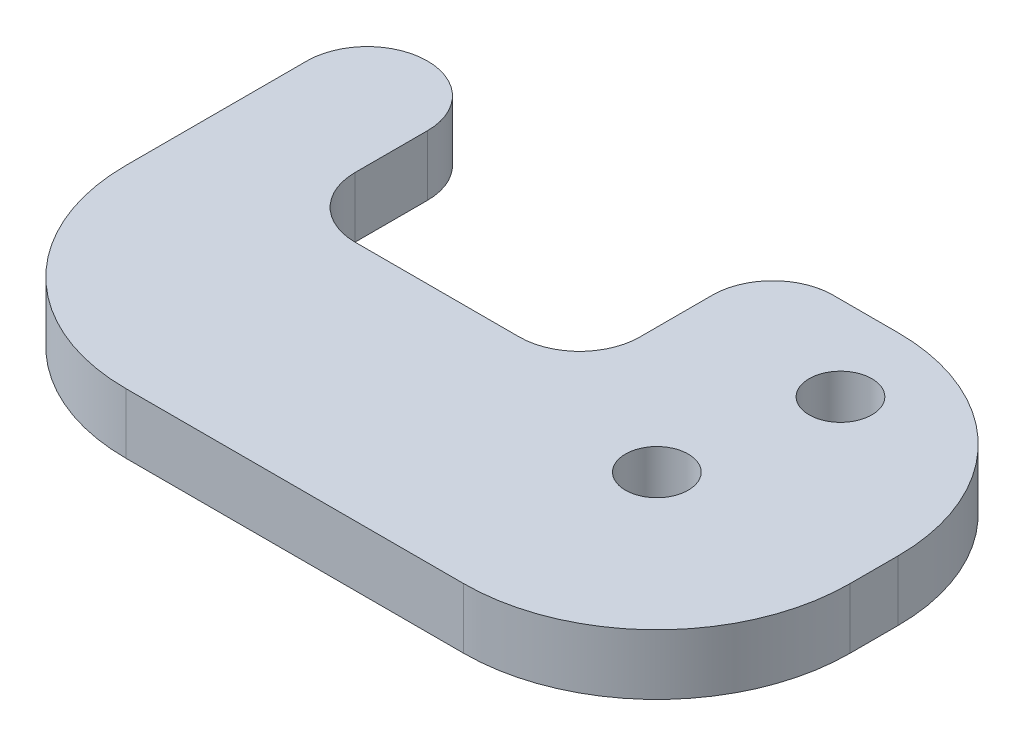
ISO-10303-21;
HEADER;
FILE_DESCRIPTION(('STEP AP214'),'2;1');
FILE_NAME('part.step','',(''),(''),'','','');
FILE_SCHEMA(('AUTOMOTIVE_DESIGN { 1 0 10303 214 1 1 1 1 }'));
ENDSEC;
DATA;
#1=APPLICATION_CONTEXT('core data for automotive mechanical design processes');
#2=APPLICATION_PROTOCOL_DEFINITION('international standard','automotive_design',2000,#1);
#3=PRODUCT_CONTEXT('',#1,'mechanical');
#4=PRODUCT('Part','Part','',(#3));
#5=PRODUCT_RELATED_PRODUCT_CATEGORY('part','',(#4));
#6=PRODUCT_DEFINITION_FORMATION('','',#4);
#7=PRODUCT_DEFINITION_CONTEXT('part definition',#1,'design');
#8=PRODUCT_DEFINITION('design','',#6,#7);
#9=PRODUCT_DEFINITION_SHAPE('','',#8);
#10=(LENGTH_UNIT() NAMED_UNIT(*) SI_UNIT(.MILLI.,.METRE.));
#11=(NAMED_UNIT(*) PLANE_ANGLE_UNIT() SI_UNIT($,.RADIAN.));
#12=(NAMED_UNIT(*) SI_UNIT($,.STERADIAN.) SOLID_ANGLE_UNIT());
#13=UNCERTAINTY_MEASURE_WITH_UNIT(LENGTH_MEASURE(1.E-05),#10,'distance_accuracy_value','');
#14=(GEOMETRIC_REPRESENTATION_CONTEXT(3) GLOBAL_UNCERTAINTY_ASSIGNED_CONTEXT((#13)) GLOBAL_UNIT_ASSIGNED_CONTEXT((#10,
#11,#12)) REPRESENTATION_CONTEXT('',''));
#15=CARTESIAN_POINT('',(0.,0.,0.));
#16=DIRECTION('',(0.,0.,1.));
#17=DIRECTION('',(1.,0.,0.));
#18=AXIS2_PLACEMENT_3D('',#15,#16,#17);
#19=CARTESIAN_POINT('',(-19.05,3.175,-11.43));
#20=DIRECTION('',(0.,0.,1.));
#21=DIRECTION('',(1.,0.,0.));
#22=AXIS2_PLACEMENT_3D('',#19,#20,#21);
#23=PLANE('',#22);
#24=DIRECTION('',(-1.,0.,0.));
#25=VECTOR('',#24,1.);
#26=CARTESIAN_POINT('',(-19.05,0.,-11.43));
#27=LINE('',#26,#25);
#28=CARTESIAN_POINT('',(8.89,0.,-11.43));
#29=VERTEX_POINT('',#28);
#30=CARTESIAN_POINT('',(5.46099999999999,0.,-11.43));
#31=VERTEX_POINT('',#30);
#32=EDGE_CURVE('E170',#29,#31,#27,.T.);
#33=ORIENTED_EDGE('',*,*,#32,.T.);
#34=DIRECTION('',(0.,1.,0.));
#35=VECTOR('',#34,1.);
#36=CARTESIAN_POINT('',(5.46099999999999,3.175,-11.43));
#37=LINE('',#36,#35);
#38=CARTESIAN_POINT('',(5.46099999999999,3.175,-11.43));
#39=VERTEX_POINT('',#38);
#40=EDGE_CURVE('E214',#31,#39,#37,.T.);
#41=ORIENTED_EDGE('',*,*,#40,.T.);
#42=DIRECTION('',(-1.,0.,0.));
#43=VECTOR('',#42,1.);
#44=CARTESIAN_POINT('',(-19.05,3.175,-11.43));
#45=LINE('',#44,#43);
#46=CARTESIAN_POINT('',(8.89,3.175,-11.43));
#47=VERTEX_POINT('',#46);
#48=EDGE_CURVE('E179',#47,#39,#45,.T.);
#49=ORIENTED_EDGE('',*,*,#48,.F.);
#50=DIRECTION('',(0.,-1.,0.));
#51=VECTOR('',#50,1.);
#52=CARTESIAN_POINT('',(8.89,3.175,-11.43));
#53=LINE('',#52,#51);
#54=EDGE_CURVE('E190',#47,#29,#53,.T.);
#55=ORIENTED_EDGE('',*,*,#54,.T.);
#56=EDGE_LOOP('',(#33,#41,#49,#55));
#57=FACE_BOUND('',#56,.T.);
#58=ADVANCED_FACE('F34',(#57),#23,.F.);
#59=CARTESIAN_POINT('',(-19.05,3.175,-11.43));
#60=DIRECTION('',(1.,0.,0.));
#61=DIRECTION('',(0.,0.,-1.));
#62=AXIS2_PLACEMENT_3D('',#59,#60,#61);
#63=PLANE('',#62);
#64=DIRECTION('',(0.,0.,1.));
#65=VECTOR('',#64,1.);
#66=CARTESIAN_POINT('',(-19.05,3.175,-11.43));
#67=LINE('',#66,#65);
#68=CARTESIAN_POINT('',(-19.05,3.175,-8.255));
#69=VERTEX_POINT('',#68);
#70=CARTESIAN_POINT('',(-19.05,3.175,1.27));
#71=VERTEX_POINT('',#70);
#72=EDGE_CURVE('E178',#69,#71,#67,.T.);
#73=ORIENTED_EDGE('',*,*,#72,.F.);
#74=DIRECTION('',(0.,-1.,0.));
#75=VECTOR('',#74,1.);
#76=CARTESIAN_POINT('',(-19.05,3.175,-8.255));
#77=LINE('',#76,#75);
#78=CARTESIAN_POINT('',(-19.05,0.,-8.255));
#79=VERTEX_POINT('',#78);
#80=EDGE_CURVE('E50',#69,#79,#77,.T.);
#81=ORIENTED_EDGE('',*,*,#80,.T.);
#82=DIRECTION('',(0.,0.,1.));
#83=VECTOR('',#82,1.);
#84=CARTESIAN_POINT('',(-19.05,0.,-11.43));
#85=LINE('',#84,#83);
#86=CARTESIAN_POINT('',(-19.05,0.,1.27));
#87=VERTEX_POINT('',#86);
#88=EDGE_CURVE('E167',#79,#87,#85,.T.);
#89=ORIENTED_EDGE('',*,*,#88,.T.);
#90=DIRECTION('',(0.,-1.,0.));
#91=VECTOR('',#90,1.);
#92=CARTESIAN_POINT('',(-19.05,3.175,1.27));
#93=LINE('',#92,#91);
#94=EDGE_CURVE('E149',#87,#71,#93,.F.);
#95=ORIENTED_EDGE('',*,*,#94,.T.);
#96=EDGE_LOOP('',(#73,#81,#89,#95));
#97=FACE_BOUND('',#96,.T.);
#98=ADVANCED_FACE('F302',(#97),#63,.F.);
#99=CARTESIAN_POINT('',(-19.05,3.175,11.43));
#100=DIRECTION('',(0.,0.,-1.));
#101=DIRECTION('',(-1.,0.,0.));
#102=AXIS2_PLACEMENT_3D('',#99,#100,#101);
#103=PLANE('',#102);
#104=DIRECTION('',(1.,0.,0.));
#105=VECTOR('',#104,1.);
#106=CARTESIAN_POINT('',(-19.05,3.175,11.43));
#107=LINE('',#106,#105);
#108=CARTESIAN_POINT('',(-8.89,3.175,11.43));
#109=VERTEX_POINT('',#108);
#110=CARTESIAN_POINT('',(8.89,3.175,11.43));
#111=VERTEX_POINT('',#110);
#112=EDGE_CURVE('E160',#109,#111,#107,.T.);
#113=ORIENTED_EDGE('',*,*,#112,.F.);
#114=DIRECTION('',(0.,-1.,0.));
#115=VECTOR('',#114,1.);
#116=CARTESIAN_POINT('',(-8.89,3.175,11.43));
#117=LINE('',#116,#115);
#118=CARTESIAN_POINT('',(-8.89,0.,11.43));
#119=VERTEX_POINT('',#118);
#120=EDGE_CURVE('E147',#109,#119,#117,.T.);
#121=ORIENTED_EDGE('',*,*,#120,.T.);
#122=DIRECTION('',(1.,0.,0.));
#123=VECTOR('',#122,1.);
#124=CARTESIAN_POINT('',(-19.05,0.,11.43));
#125=LINE('',#124,#123);
#126=CARTESIAN_POINT('',(8.89,0.,11.43));
#127=VERTEX_POINT('',#126);
#128=EDGE_CURVE('E157',#119,#127,#125,.T.);
#129=ORIENTED_EDGE('',*,*,#128,.T.);
#130=DIRECTION('',(0.,-1.,0.));
#131=VECTOR('',#130,1.);
#132=CARTESIAN_POINT('',(8.89,3.175,11.43));
#133=LINE('',#132,#131);
#134=EDGE_CURVE('E161',#127,#111,#133,.F.);
#135=ORIENTED_EDGE('',*,*,#134,.T.);
#136=EDGE_LOOP('',(#113,#121,#129,#135));
#137=FACE_BOUND('',#136,.T.);
#138=ADVANCED_FACE('F156',(#137),#103,.F.);
#139=CARTESIAN_POINT('',(19.05,3.175,-11.43));
#140=DIRECTION('',(-1.,0.,0.));
#141=DIRECTION('',(0.,0.,1.));
#142=AXIS2_PLACEMENT_3D('',#139,#140,#141);
#143=PLANE('',#142);
#144=DIRECTION('',(0.,0.,-1.));
#145=VECTOR('',#144,1.);
#146=CARTESIAN_POINT('',(19.05,0.,-11.43));
#147=LINE('',#146,#145);
#148=CARTESIAN_POINT('',(19.05,0.,1.27));
#149=VERTEX_POINT('',#148);
#150=CARTESIAN_POINT('',(19.05,0.,-1.27));
#151=VERTEX_POINT('',#150);
#152=EDGE_CURVE('E166',#149,#151,#147,.T.);
#153=ORIENTED_EDGE('',*,*,#152,.T.);
#154=DIRECTION('',(0.,-1.,0.));
#155=VECTOR('',#154,1.);
#156=CARTESIAN_POINT('',(19.05,3.175,-1.27));
#157=LINE('',#156,#155);
#158=CARTESIAN_POINT('',(19.05,3.175,-1.27));
#159=VERTEX_POINT('',#158);
#160=EDGE_CURVE('E195',#151,#159,#157,.F.);
#161=ORIENTED_EDGE('',*,*,#160,.T.);
#162=DIRECTION('',(0.,0.,-1.));
#163=VECTOR('',#162,1.);
#164=CARTESIAN_POINT('',(19.05,3.175,-11.43));
#165=LINE('',#164,#163);
#166=CARTESIAN_POINT('',(19.05,3.175,1.27));
#167=VERTEX_POINT('',#166);
#168=EDGE_CURVE('E283',#167,#159,#165,.T.);
#169=ORIENTED_EDGE('',*,*,#168,.F.);
#170=DIRECTION('',(0.,-1.,0.));
#171=VECTOR('',#170,1.);
#172=CARTESIAN_POINT('',(19.05,3.175,1.27));
#173=LINE('',#172,#171);
#174=EDGE_CURVE('E187',#167,#149,#173,.T.);
#175=ORIENTED_EDGE('',*,*,#174,.T.);
#176=EDGE_LOOP('',(#153,#161,#169,#175));
#177=FACE_BOUND('',#176,.T.);
#178=ADVANCED_FACE('F295',(#177),#143,.F.);
#179=CARTESIAN_POINT('',(0.,3.175,0.));
#180=DIRECTION('',(0.,1.,0.));
#181=DIRECTION('',(0.,0.,1.));
#182=AXIS2_PLACEMENT_3D('',#179,#180,#181);
#183=PLANE('',#182);
#184=ORIENTED_EDGE('',*,*,#48,.T.);
#185=CARTESIAN_POINT('',(5.46099999999999,3.175,-8.255));
#186=DIRECTION('',(0.,1.,0.));
#187=DIRECTION('',(0.,0.,1.));
#188=AXIS2_PLACEMENT_3D('',#185,#186,#187);
#189=CIRCLE('',#188,3.175);
#190=CARTESIAN_POINT('',(2.28599999999999,3.175,-8.255));
#191=VERTEX_POINT('',#190);
#192=EDGE_CURVE('E221',#39,#191,#189,.T.);
#193=ORIENTED_EDGE('',*,*,#192,.T.);
#194=DIRECTION('',(0.,0.,1.));
#195=VECTOR('',#194,1.);
#196=CARTESIAN_POINT('',(2.28599999999999,3.175,-11.43));
#197=LINE('',#196,#195);
#198=CARTESIAN_POINT('',(2.28599999999999,3.175,-4.44499999999997));
#199=VERTEX_POINT('',#198);
#200=EDGE_CURVE('E242',#191,#199,#197,.T.);
#201=ORIENTED_EDGE('',*,*,#200,.T.);
#202=CARTESIAN_POINT('',(-0.889000000000006,3.175,-4.44499999999997));
#203=DIRECTION('',(0.,1.,0.));
#204=DIRECTION('',(0.,0.,1.));
#205=AXIS2_PLACEMENT_3D('',#202,#203,#204);
#206=CIRCLE('',#205,3.175);
#207=CARTESIAN_POINT('',(-0.889000000000006,3.175,-1.26999999999997));
#208=VERTEX_POINT('',#207);
#209=EDGE_CURVE('E43',#199,#208,#206,.F.);
#210=ORIENTED_EDGE('',*,*,#209,.T.);
#211=DIRECTION('',(1.,0.,0.));
#212=VECTOR('',#211,1.);
#213=CARTESIAN_POINT('',(-12.7,3.175,-1.26999999999997));
#214=LINE('',#213,#212);
#215=CARTESIAN_POINT('',(-9.525,3.175,-1.26999999999997));
#216=VERTEX_POINT('',#215);
#217=EDGE_CURVE('E240',#216,#208,#214,.T.);
#218=ORIENTED_EDGE('',*,*,#217,.F.);
#219=CARTESIAN_POINT('',(-9.525,3.175,-4.44499999999997));
#220=DIRECTION('',(0.,1.,0.));
#221=DIRECTION('',(0.,0.,1.));
#222=AXIS2_PLACEMENT_3D('',#219,#220,#221);
#223=CIRCLE('',#222,3.175);
#224=CARTESIAN_POINT('',(-12.7,3.175,-4.44499999999996));
#225=VERTEX_POINT('',#224);
#226=EDGE_CURVE('E229',#216,#225,#223,.F.);
#227=ORIENTED_EDGE('',*,*,#226,.T.);
#228=DIRECTION('',(0.,0.,1.));
#229=VECTOR('',#228,1.);
#230=CARTESIAN_POINT('',(-12.7,3.175,-11.43));
#231=LINE('',#230,#229);
#232=CARTESIAN_POINT('',(-12.7,3.175,-8.255));
#233=VERTEX_POINT('',#232);
#234=EDGE_CURVE('E251',#233,#225,#231,.T.);
#235=ORIENTED_EDGE('',*,*,#234,.F.);
#236=CARTESIAN_POINT('',(-15.875,3.175,-8.255));
#237=DIRECTION('',(0.,1.,0.));
#238=DIRECTION('',(0.,0.,1.));
#239=AXIS2_PLACEMENT_3D('',#236,#237,#238);
#240=CIRCLE('',#239,3.175);
#241=CARTESIAN_POINT('',(-15.875,3.175,-11.43));
#242=VERTEX_POINT('',#241);
#243=EDGE_CURVE('E219',#233,#242,#240,.T.);
#244=ORIENTED_EDGE('',*,*,#243,.T.);
#245=CARTESIAN_POINT('',(-15.875,3.175,-8.255));
#246=DIRECTION('',(0.,1.,0.));
#247=DIRECTION('',(0.,0.,1.));
#248=AXIS2_PLACEMENT_3D('',#245,#246,#247);
#249=CIRCLE('',#248,3.175);
#250=EDGE_CURVE('E217',#242,#69,#249,.T.);
#251=ORIENTED_EDGE('',*,*,#250,.T.);
#252=ORIENTED_EDGE('',*,*,#72,.T.);
#253=CARTESIAN_POINT('',(-8.89,3.175,1.27));
#254=DIRECTION('',(0.,1.,0.));
#255=DIRECTION('',(0.,0.,1.));
#256=AXIS2_PLACEMENT_3D('',#253,#254,#255);
#257=CIRCLE('',#256,10.16);
#258=EDGE_CURVE('E185',#71,#109,#257,.T.);
#259=ORIENTED_EDGE('',*,*,#258,.T.);
#260=ORIENTED_EDGE('',*,*,#112,.T.);
#261=CARTESIAN_POINT('',(8.89,3.175,1.27));
#262=DIRECTION('',(0.,1.,0.));
#263=DIRECTION('',(0.,0.,1.));
#264=AXIS2_PLACEMENT_3D('',#261,#262,#263);
#265=CIRCLE('',#264,10.16);
#266=EDGE_CURVE('E183',#111,#167,#265,.T.);
#267=ORIENTED_EDGE('',*,*,#266,.T.);
#268=ORIENTED_EDGE('',*,*,#168,.T.);
#269=CARTESIAN_POINT('',(8.89,3.175,-1.27));
#270=DIRECTION('',(0.,1.,0.));
#271=DIRECTION('',(0.,0.,1.));
#272=AXIS2_PLACEMENT_3D('',#269,#270,#271);
#273=CIRCLE('',#272,10.16);
#274=EDGE_CURVE('E197',#159,#47,#273,.T.);
#275=ORIENTED_EDGE('',*,*,#274,.T.);
#276=EDGE_LOOP('',(#184,#193,#201,#210,#218,#227,#235,#244,#251,#252,#259,#260,#267,#268,#275));
#277=FACE_BOUND('',#276,.T.);
#278=CARTESIAN_POINT('',(10.287,3.175,-6.99476345699017));
#279=DIRECTION('',(0.,1.,0.));
#280=DIRECTION('',(0.,0.,1.));
#281=AXIS2_PLACEMENT_3D('',#278,#279,#280);
#282=CIRCLE('',#281,1.651);
#283=CARTESIAN_POINT('',(10.287,3.175,-5.34376345699017));
#284=VERTEX_POINT('',#283);
#285=EDGE_CURVE('E265',#284,#284,#282,.T.);
#286=ORIENTED_EDGE('',*,*,#285,.F.);
#287=EDGE_LOOP('',(#286));
#288=FACE_BOUND('',#287,.T.);
#289=CARTESIAN_POINT('',(8.89,3.175,1.27));
#290=DIRECTION('',(0.,1.,0.));
#291=DIRECTION('',(0.,0.,1.));
#292=AXIS2_PLACEMENT_3D('',#289,#290,#291);
#293=CIRCLE('',#292,1.651);
#294=CARTESIAN_POINT('',(8.89,3.175,2.92099999999999));
#295=VERTEX_POINT('',#294);
#296=EDGE_CURVE('E275',#295,#295,#293,.T.);
#297=ORIENTED_EDGE('',*,*,#296,.F.);
#298=EDGE_LOOP('',(#297));
#299=FACE_BOUND('',#298,.T.);
#300=ADVANCED_FACE('F238',(#277,#288,#299),#183,.T.);
#301=CARTESIAN_POINT('',(0.,0.,0.));
#302=DIRECTION('',(0.,1.,0.));
#303=DIRECTION('',(0.,0.,1.));
#304=AXIS2_PLACEMENT_3D('',#301,#302,#303);
#305=PLANE('',#304);
#306=CARTESIAN_POINT('',(10.287,0.,-6.99476345699017));
#307=DIRECTION('',(0.,1.,0.));
#308=DIRECTION('',(0.,0.,1.));
#309=AXIS2_PLACEMENT_3D('',#306,#307,#308);
#310=CIRCLE('',#309,1.651);
#311=CARTESIAN_POINT('',(10.287,0.,-5.34376345699017));
#312=VERTEX_POINT('',#311);
#313=EDGE_CURVE('E262',#312,#312,#310,.T.);
#314=ORIENTED_EDGE('',*,*,#313,.T.);
#315=EDGE_LOOP('',(#314));
#316=FACE_BOUND('',#315,.T.);
#317=CARTESIAN_POINT('',(8.89,0.,1.27));
#318=DIRECTION('',(0.,1.,0.));
#319=DIRECTION('',(0.,0.,1.));
#320=AXIS2_PLACEMENT_3D('',#317,#318,#319);
#321=CIRCLE('',#320,1.651);
#322=CARTESIAN_POINT('',(8.89,0.,2.92099999999999));
#323=VERTEX_POINT('',#322);
#324=EDGE_CURVE('E172',#323,#323,#321,.T.);
#325=ORIENTED_EDGE('',*,*,#324,.T.);
#326=EDGE_LOOP('',(#325));
#327=FACE_BOUND('',#326,.T.);
#328=DIRECTION('',(0.,0.,1.));
#329=VECTOR('',#328,1.);
#330=CARTESIAN_POINT('',(2.28599999999999,0.,-11.43));
#331=LINE('',#330,#329);
#332=CARTESIAN_POINT('',(2.28599999999999,0.,-8.255));
#333=VERTEX_POINT('',#332);
#334=CARTESIAN_POINT('',(2.28599999999999,0.,-4.44499999999997));
#335=VERTEX_POINT('',#334);
#336=EDGE_CURVE('E256',#333,#335,#331,.T.);
#337=ORIENTED_EDGE('',*,*,#336,.F.);
#338=CARTESIAN_POINT('',(5.46099999999999,0.,-8.255));
#339=DIRECTION('',(0.,1.,0.));
#340=DIRECTION('',(0.,0.,1.));
#341=AXIS2_PLACEMENT_3D('',#338,#339,#340);
#342=CIRCLE('',#341,3.175);
#343=EDGE_CURVE('E226',#333,#31,#342,.F.);
#344=ORIENTED_EDGE('',*,*,#343,.T.);
#345=ORIENTED_EDGE('',*,*,#32,.F.);
#346=CARTESIAN_POINT('',(8.89,0.,-1.27));
#347=DIRECTION('',(0.,1.,0.));
#348=DIRECTION('',(0.,0.,1.));
#349=AXIS2_PLACEMENT_3D('',#346,#347,#348);
#350=CIRCLE('',#349,10.16);
#351=EDGE_CURVE('E193',#29,#151,#350,.F.);
#352=ORIENTED_EDGE('',*,*,#351,.T.);
#353=ORIENTED_EDGE('',*,*,#152,.F.);
#354=CARTESIAN_POINT('',(8.89,0.,1.27));
#355=DIRECTION('',(0.,1.,0.));
#356=DIRECTION('',(0.,0.,1.));
#357=AXIS2_PLACEMENT_3D('',#354,#355,#356);
#358=CIRCLE('',#357,10.16);
#359=EDGE_CURVE('E151',#149,#127,#358,.F.);
#360=ORIENTED_EDGE('',*,*,#359,.T.);
#361=ORIENTED_EDGE('',*,*,#128,.F.);
#362=CARTESIAN_POINT('',(-8.89,0.,1.27));
#363=DIRECTION('',(0.,1.,0.));
#364=DIRECTION('',(0.,0.,1.));
#365=AXIS2_PLACEMENT_3D('',#362,#363,#364);
#366=CIRCLE('',#365,10.16);
#367=EDGE_CURVE('E143',#119,#87,#366,.F.);
#368=ORIENTED_EDGE('',*,*,#367,.T.);
#369=ORIENTED_EDGE('',*,*,#88,.F.);
#370=CARTESIAN_POINT('',(-15.875,0.,-8.255));
#371=DIRECTION('',(0.,1.,0.));
#372=DIRECTION('',(0.,0.,1.));
#373=AXIS2_PLACEMENT_3D('',#370,#371,#372);
#374=CIRCLE('',#373,3.175);
#375=CARTESIAN_POINT('',(-15.875,0.,-11.43));
#376=VERTEX_POINT('',#375);
#377=EDGE_CURVE('E57',#79,#376,#374,.F.);
#378=ORIENTED_EDGE('',*,*,#377,.T.);
#379=CARTESIAN_POINT('',(-15.875,0.,-8.255));
#380=DIRECTION('',(0.,1.,0.));
#381=DIRECTION('',(0.,0.,1.));
#382=AXIS2_PLACEMENT_3D('',#379,#380,#381);
#383=CIRCLE('',#382,3.175);
#384=CARTESIAN_POINT('',(-12.7,0.,-8.255));
#385=VERTEX_POINT('',#384);
#386=EDGE_CURVE('E224',#376,#385,#383,.F.);
#387=ORIENTED_EDGE('',*,*,#386,.T.);
#388=DIRECTION('',(0.,0.,1.));
#389=VECTOR('',#388,1.);
#390=CARTESIAN_POINT('',(-12.7,0.,-11.43));
#391=LINE('',#390,#389);
#392=CARTESIAN_POINT('',(-12.7,0.,-4.44499999999996));
#393=VERTEX_POINT('',#392);
#394=EDGE_CURVE('E267',#385,#393,#391,.T.);
#395=ORIENTED_EDGE('',*,*,#394,.T.);
#396=CARTESIAN_POINT('',(-9.525,0.,-4.44499999999997));
#397=DIRECTION('',(0.,1.,0.));
#398=DIRECTION('',(0.,0.,1.));
#399=AXIS2_PLACEMENT_3D('',#396,#397,#398);
#400=CIRCLE('',#399,3.175);
#401=CARTESIAN_POINT('',(-9.525,0.,-1.26999999999997));
#402=VERTEX_POINT('',#401);
#403=EDGE_CURVE('E231',#393,#402,#400,.T.);
#404=ORIENTED_EDGE('',*,*,#403,.T.);
#405=DIRECTION('',(1.,0.,0.));
#406=VECTOR('',#405,1.);
#407=CARTESIAN_POINT('',(-12.7,0.,-1.26999999999997));
#408=LINE('',#407,#406);
#409=CARTESIAN_POINT('',(-0.889000000000006,0.,-1.26999999999997));
#410=VERTEX_POINT('',#409);
#411=EDGE_CURVE('E258',#402,#410,#408,.T.);
#412=ORIENTED_EDGE('',*,*,#411,.T.);
#413=CARTESIAN_POINT('',(-0.889000000000006,0.,-4.44499999999997));
#414=DIRECTION('',(0.,1.,0.));
#415=DIRECTION('',(0.,0.,1.));
#416=AXIS2_PLACEMENT_3D('',#413,#414,#415);
#417=CIRCLE('',#416,3.175);
#418=EDGE_CURVE('E11',#410,#335,#417,.T.);
#419=ORIENTED_EDGE('',*,*,#418,.T.);
#420=EDGE_LOOP('',(#337,#344,#345,#352,#353,#360,#361,#368,#369,#378,#387,#395,#404,#412,#419));
#421=FACE_BOUND('',#420,.T.);
#422=ADVANCED_FACE('F164',(#316,#327,#421),#305,.F.);
#423=CARTESIAN_POINT('',(-8.89,3.175,1.27));
#424=DIRECTION('',(0.,-1.,0.));
#425=DIRECTION('',(0.,0.,-1.));
#426=AXIS2_PLACEMENT_3D('',#423,#424,#425);
#427=CYLINDRICAL_SURFACE('',#426,10.16);
#428=ORIENTED_EDGE('',*,*,#258,.F.);
#429=ORIENTED_EDGE('',*,*,#94,.F.);
#430=ORIENTED_EDGE('',*,*,#367,.F.);
#431=ORIENTED_EDGE('',*,*,#120,.F.);
#432=EDGE_LOOP('',(#428,#429,#430,#431));
#433=FACE_BOUND('',#432,.T.);
#434=ADVANCED_FACE('F146',(#433),#427,.T.);
#435=CARTESIAN_POINT('',(8.89,3.175,1.27));
#436=DIRECTION('',(0.,-1.,0.));
#437=DIRECTION('',(0.,0.,-1.));
#438=AXIS2_PLACEMENT_3D('',#435,#436,#437);
#439=CYLINDRICAL_SURFACE('',#438,10.16);
#440=ORIENTED_EDGE('',*,*,#266,.F.);
#441=ORIENTED_EDGE('',*,*,#134,.F.);
#442=ORIENTED_EDGE('',*,*,#359,.F.);
#443=ORIENTED_EDGE('',*,*,#174,.F.);
#444=EDGE_LOOP('',(#440,#441,#442,#443));
#445=FACE_BOUND('',#444,.T.);
#446=ADVANCED_FACE('F300',(#445),#439,.T.);
#447=CARTESIAN_POINT('',(8.89,0.,1.27));
#448=DIRECTION('',(0.,1.,0.));
#449=DIRECTION('',(0.,0.,1.));
#450=AXIS2_PLACEMENT_3D('',#447,#448,#449);
#451=CYLINDRICAL_SURFACE('',#450,1.651);
#452=ORIENTED_EDGE('',*,*,#324,.F.);
#453=EDGE_LOOP('',(#452));
#454=FACE_BOUND('',#453,.T.);
#455=ORIENTED_EDGE('',*,*,#296,.T.);
#456=EDGE_LOOP('',(#455));
#457=FACE_BOUND('',#456,.T.);
#458=ADVANCED_FACE('F344',(#454,#457),#451,.F.);
#459=CARTESIAN_POINT('',(10.287,0.,-6.99476345699017));
#460=DIRECTION('',(0.,1.,0.));
#461=DIRECTION('',(0.,0.,1.));
#462=AXIS2_PLACEMENT_3D('',#459,#460,#461);
#463=CYLINDRICAL_SURFACE('',#462,1.651);
#464=ORIENTED_EDGE('',*,*,#313,.F.);
#465=EDGE_LOOP('',(#464));
#466=FACE_BOUND('',#465,.T.);
#467=ORIENTED_EDGE('',*,*,#285,.T.);
#468=EDGE_LOOP('',(#467));
#469=FACE_BOUND('',#468,.T.);
#470=ADVANCED_FACE('F346',(#466,#469),#463,.F.);
#471=CARTESIAN_POINT('',(8.89,3.175,-1.27));
#472=DIRECTION('',(0.,-1.,0.));
#473=DIRECTION('',(0.,0.,-1.));
#474=AXIS2_PLACEMENT_3D('',#471,#472,#473);
#475=CYLINDRICAL_SURFACE('',#474,10.16);
#476=ORIENTED_EDGE('',*,*,#274,.F.);
#477=ORIENTED_EDGE('',*,*,#160,.F.);
#478=ORIENTED_EDGE('',*,*,#351,.F.);
#479=ORIENTED_EDGE('',*,*,#54,.F.);
#480=EDGE_LOOP('',(#476,#477,#478,#479));
#481=FACE_BOUND('',#480,.T.);
#482=ADVANCED_FACE('F292',(#481),#475,.T.);
#483=CARTESIAN_POINT('',(-12.7,0.,-11.43));
#484=DIRECTION('',(-1.,0.,0.));
#485=DIRECTION('',(0.,0.,1.));
#486=AXIS2_PLACEMENT_3D('',#483,#484,#485);
#487=PLANE('',#486);
#488=ORIENTED_EDGE('',*,*,#234,.T.);
#489=DIRECTION('',(0.,1.,0.));
#490=VECTOR('',#489,1.);
#491=CARTESIAN_POINT('',(-12.7,0.,-4.44499999999996));
#492=LINE('',#491,#490);
#493=EDGE_CURVE('E207',#225,#393,#492,.F.);
#494=ORIENTED_EDGE('',*,*,#493,.T.);
#495=ORIENTED_EDGE('',*,*,#394,.F.);
#496=DIRECTION('',(0.,1.,0.));
#497=VECTOR('',#496,1.);
#498=CARTESIAN_POINT('',(-12.7,0.,-8.255));
#499=LINE('',#498,#497);
#500=EDGE_CURVE('E204',#385,#233,#499,.T.);
#501=ORIENTED_EDGE('',*,*,#500,.T.);
#502=EDGE_LOOP('',(#488,#494,#495,#501));
#503=FACE_BOUND('',#502,.T.);
#504=ADVANCED_FACE('F313',(#503),#487,.F.);
#505=CARTESIAN_POINT('',(2.28599999999999,0.,-11.43));
#506=DIRECTION('',(-1.,0.,0.));
#507=DIRECTION('',(0.,0.,1.));
#508=AXIS2_PLACEMENT_3D('',#505,#506,#507);
#509=PLANE('',#508);
#510=ORIENTED_EDGE('',*,*,#336,.T.);
#511=DIRECTION('',(0.,1.,0.));
#512=VECTOR('',#511,1.);
#513=CARTESIAN_POINT('',(2.28599999999999,0.,-4.44499999999997));
#514=LINE('',#513,#512);
#515=EDGE_CURVE('E211',#335,#199,#514,.T.);
#516=ORIENTED_EDGE('',*,*,#515,.T.);
#517=ORIENTED_EDGE('',*,*,#200,.F.);
#518=DIRECTION('',(0.,1.,0.));
#519=VECTOR('',#518,1.);
#520=CARTESIAN_POINT('',(2.28599999999999,0.,-8.255));
#521=LINE('',#520,#519);
#522=EDGE_CURVE('E209',#191,#333,#521,.F.);
#523=ORIENTED_EDGE('',*,*,#522,.T.);
#524=EDGE_LOOP('',(#510,#516,#517,#523));
#525=FACE_BOUND('',#524,.T.);
#526=ADVANCED_FACE('F260',(#525),#509,.T.);
#527=CARTESIAN_POINT('',(-12.7,0.,-1.26999999999997));
#528=DIRECTION('',(0.,0.,1.));
#529=DIRECTION('',(1.,0.,0.));
#530=AXIS2_PLACEMENT_3D('',#527,#528,#529);
#531=PLANE('',#530);
#532=ORIENTED_EDGE('',*,*,#411,.F.);
#533=DIRECTION('',(0.,1.,0.));
#534=VECTOR('',#533,1.);
#535=CARTESIAN_POINT('',(-9.525,3.175,-1.26999999999997));
#536=LINE('',#535,#534);
#537=EDGE_CURVE('E201',#402,#216,#536,.T.);
#538=ORIENTED_EDGE('',*,*,#537,.T.);
#539=ORIENTED_EDGE('',*,*,#217,.T.);
#540=DIRECTION('',(0.,1.,0.));
#541=VECTOR('',#540,1.);
#542=CARTESIAN_POINT('',(-0.889000000000006,0.,-1.26999999999997));
#543=LINE('',#542,#541);
#544=EDGE_CURVE('E199',#208,#410,#543,.F.);
#545=ORIENTED_EDGE('',*,*,#544,.T.);
#546=EDGE_LOOP('',(#532,#538,#539,#545));
#547=FACE_BOUND('',#546,.T.);
#548=ADVANCED_FACE('F248',(#547),#531,.F.);
#549=CARTESIAN_POINT('',(-9.525,0.,-4.44499999999997));
#550=DIRECTION('',(0.,-1.,0.));
#551=DIRECTION('',(0.,0.,-1.));
#552=AXIS2_PLACEMENT_3D('',#549,#550,#551);
#553=CYLINDRICAL_SURFACE('',#552,3.175);
#554=ORIENTED_EDGE('',*,*,#403,.F.);
#555=ORIENTED_EDGE('',*,*,#493,.F.);
#556=ORIENTED_EDGE('',*,*,#226,.F.);
#557=ORIENTED_EDGE('',*,*,#537,.F.);
#558=EDGE_LOOP('',(#554,#555,#556,#557));
#559=FACE_BOUND('',#558,.T.);
#560=ADVANCED_FACE('F317',(#559),#553,.F.);
#561=CARTESIAN_POINT('',(-0.889000000000006,0.,-4.44499999999997));
#562=DIRECTION('',(0.,1.,0.));
#563=DIRECTION('',(0.,0.,1.));
#564=AXIS2_PLACEMENT_3D('',#561,#562,#563);
#565=CYLINDRICAL_SURFACE('',#564,3.175);
#566=ORIENTED_EDGE('',*,*,#418,.F.);
#567=ORIENTED_EDGE('',*,*,#544,.F.);
#568=ORIENTED_EDGE('',*,*,#209,.F.);
#569=ORIENTED_EDGE('',*,*,#515,.F.);
#570=EDGE_LOOP('',(#566,#567,#568,#569));
#571=FACE_BOUND('',#570,.T.);
#572=ADVANCED_FACE('F254',(#571),#565,.F.);
#573=CARTESIAN_POINT('',(5.46099999999999,3.175,-8.255));
#574=DIRECTION('',(0.,-1.,0.));
#575=DIRECTION('',(0.,0.,-1.));
#576=AXIS2_PLACEMENT_3D('',#573,#574,#575);
#577=CYLINDRICAL_SURFACE('',#576,3.175);
#578=ORIENTED_EDGE('',*,*,#343,.F.);
#579=ORIENTED_EDGE('',*,*,#522,.F.);
#580=ORIENTED_EDGE('',*,*,#192,.F.);
#581=ORIENTED_EDGE('',*,*,#40,.F.);
#582=EDGE_LOOP('',(#578,#579,#580,#581));
#583=FACE_BOUND('',#582,.T.);
#584=ADVANCED_FACE('F324',(#583),#577,.T.);
#585=CARTESIAN_POINT('',(-15.875,3.175,-8.255));
#586=DIRECTION('',(0.,-1.,0.));
#587=DIRECTION('',(0.,0.,-1.));
#588=AXIS2_PLACEMENT_3D('',#585,#586,#587);
#589=CYLINDRICAL_SURFACE('',#588,3.175);
#590=DIRECTION('',(0.,-1.,0.));
#591=VECTOR('',#590,1.);
#592=CARTESIAN_POINT('',(-15.875,3.175,-11.43));
#593=LINE('',#592,#591);
#594=EDGE_CURVE('E38',#376,#242,#593,.F.);
#595=ORIENTED_EDGE('',*,*,#594,.F.);
#596=ORIENTED_EDGE('',*,*,#377,.F.);
#597=ORIENTED_EDGE('',*,*,#80,.F.);
#598=ORIENTED_EDGE('',*,*,#250,.F.);
#599=EDGE_LOOP('',(#595,#596,#597,#598));
#600=FACE_BOUND('',#599,.T.);
#601=ADVANCED_FACE('F36',(#600),#589,.T.);
#602=CARTESIAN_POINT('',(-15.875,0.,-8.255));
#603=DIRECTION('',(0.,1.,0.));
#604=DIRECTION('',(0.,0.,1.));
#605=AXIS2_PLACEMENT_3D('',#602,#603,#604);
#606=CYLINDRICAL_SURFACE('',#605,3.175);
#607=ORIENTED_EDGE('',*,*,#386,.F.);
#608=ORIENTED_EDGE('',*,*,#594,.T.);
#609=ORIENTED_EDGE('',*,*,#243,.F.);
#610=ORIENTED_EDGE('',*,*,#500,.F.);
#611=EDGE_LOOP('',(#607,#608,#609,#610));
#612=FACE_BOUND('',#611,.T.);
#613=ADVANCED_FACE('F308',(#612),#606,.T.);
#614=CLOSED_SHELL('',(#58,#98,#138,#178,#300,#422,#434,#446,#458,#470,#482,#504,#526,#548,#560,
#572,#584,#601,#613));
#615=MANIFOLD_SOLID_BREP('B2',#614);
#616=ADVANCED_BREP_SHAPE_REPRESENTATION('',(#18,#615),#14);
#617=SHAPE_DEFINITION_REPRESENTATION(#9,#616);
ENDSEC;
END-ISO-10303-21;
